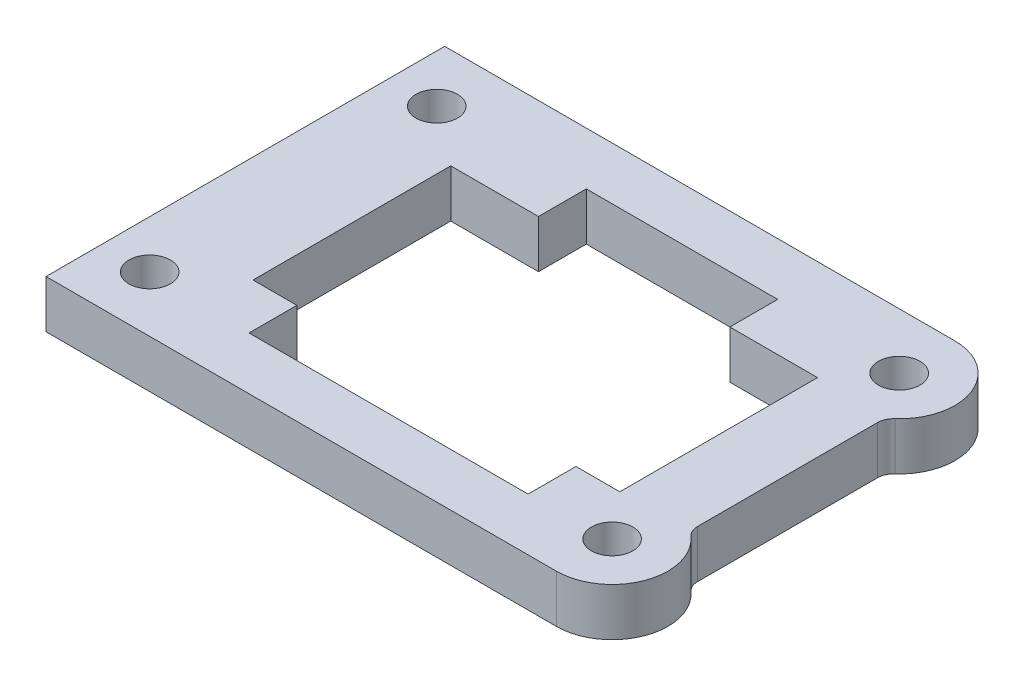
ISO-10303-21;
HEADER;
FILE_DESCRIPTION(('STEP AP214'),'2;1');
FILE_NAME('part.step','',(''),(''),'','','');
FILE_SCHEMA(('AUTOMOTIVE_DESIGN { 1 0 10303 214 1 1 1 1 }'));
ENDSEC;
DATA;
#1=APPLICATION_CONTEXT('core data for automotive mechanical design processes');
#2=APPLICATION_PROTOCOL_DEFINITION('international standard','automotive_design',2000,#1);
#3=PRODUCT_CONTEXT('',#1,'mechanical');
#4=PRODUCT('Part','Part','',(#3));
#5=PRODUCT_RELATED_PRODUCT_CATEGORY('part','',(#4));
#6=PRODUCT_DEFINITION_FORMATION('','',#4);
#7=PRODUCT_DEFINITION_CONTEXT('part definition',#1,'design');
#8=PRODUCT_DEFINITION('design','',#6,#7);
#9=PRODUCT_DEFINITION_SHAPE('','',#8);
#10=(LENGTH_UNIT() NAMED_UNIT(*) SI_UNIT(.MILLI.,.METRE.));
#11=(NAMED_UNIT(*) PLANE_ANGLE_UNIT() SI_UNIT($,.RADIAN.));
#12=(NAMED_UNIT(*) SI_UNIT($,.STERADIAN.) SOLID_ANGLE_UNIT());
#13=UNCERTAINTY_MEASURE_WITH_UNIT(LENGTH_MEASURE(1.E-05),#10,'distance_accuracy_value','');
#14=(GEOMETRIC_REPRESENTATION_CONTEXT(3) GLOBAL_UNCERTAINTY_ASSIGNED_CONTEXT((#13)) GLOBAL_UNIT_ASSIGNED_CONTEXT((#10,
#11,#12)) REPRESENTATION_CONTEXT('',''));
#15=CARTESIAN_POINT('',(0.,0.,0.));
#16=DIRECTION('',(0.,0.,1.));
#17=DIRECTION('',(1.,0.,0.));
#18=AXIS2_PLACEMENT_3D('',#15,#16,#17);
#19=CARTESIAN_POINT('',(-10.82,0.,6.20000000000002));
#20=DIRECTION('',(0.,0.,1.));
#21=DIRECTION('',(1.,0.,0.));
#22=AXIS2_PLACEMENT_3D('',#19,#20,#21);
#23=PLANE('',#22);
#24=DIRECTION('',(1.,0.,0.));
#25=VECTOR('',#24,1.);
#26=CARTESIAN_POINT('',(-10.82,0.,6.20000000000002));
#27=LINE('',#26,#25);
#28=CARTESIAN_POINT('',(9.43,0.,6.20000000000001));
#29=VERTEX_POINT('',#28);
#30=CARTESIAN_POINT('',(12.18,0.,6.2));
#31=VERTEX_POINT('',#30);
#32=EDGE_CURVE('E248',#29,#31,#27,.T.);
#33=ORIENTED_EDGE('',*,*,#32,.F.);
#34=DIRECTION('',(0.,1.,0.));
#35=VECTOR('',#34,1.);
#36=CARTESIAN_POINT('',(9.43,0.,6.20000000000001));
#37=LINE('',#36,#35);
#38=CARTESIAN_POINT('',(9.43,3.,6.20000000000001));
#39=VERTEX_POINT('',#38);
#40=EDGE_CURVE('E225',#29,#39,#37,.T.);
#41=ORIENTED_EDGE('',*,*,#40,.T.);
#42=DIRECTION('',(1.,0.,0.));
#43=VECTOR('',#42,1.);
#44=CARTESIAN_POINT('',(-10.82,3.,6.20000000000002));
#45=LINE('',#44,#43);
#46=CARTESIAN_POINT('',(12.18,3.,6.2));
#47=VERTEX_POINT('',#46);
#48=EDGE_CURVE('E261',#39,#47,#45,.T.);
#49=ORIENTED_EDGE('',*,*,#48,.T.);
#50=DIRECTION('',(0.,1.,0.));
#51=VECTOR('',#50,1.);
#52=CARTESIAN_POINT('',(12.18,0.,6.2));
#53=LINE('',#52,#51);
#54=EDGE_CURVE('E264',#31,#47,#53,.T.);
#55=ORIENTED_EDGE('',*,*,#54,.F.);
#56=EDGE_LOOP('',(#33,#41,#49,#55));
#57=FACE_BOUND('',#56,.T.);
#58=ADVANCED_FACE('F36',(#57),#23,.F.);
#59=CARTESIAN_POINT('',(-10.82,0.,-6.19999999999996));
#60=DIRECTION('',(0.,0.,-1.));
#61=DIRECTION('',(-1.,0.,0.));
#62=AXIS2_PLACEMENT_3D('',#59,#60,#61);
#63=PLANE('',#62);
#64=DIRECTION('',(-1.,0.,0.));
#65=VECTOR('',#64,1.);
#66=CARTESIAN_POINT('',(-10.82,3.,-6.19999999999996));
#67=LINE('',#66,#65);
#68=CARTESIAN_POINT('',(12.18,3.,-6.2));
#69=VERTEX_POINT('',#68);
#70=CARTESIAN_POINT('',(6.68,3.,-6.19999999999997));
#71=VERTEX_POINT('',#70);
#72=EDGE_CURVE('E255',#69,#71,#67,.T.);
#73=ORIENTED_EDGE('',*,*,#72,.T.);
#74=DIRECTION('',(0.,1.,0.));
#75=VECTOR('',#74,1.);
#76=CARTESIAN_POINT('',(6.68,0.,-6.19999999999997));
#77=LINE('',#76,#75);
#78=CARTESIAN_POINT('',(6.68,0.,-6.19999999999997));
#79=VERTEX_POINT('',#78);
#80=EDGE_CURVE('E211',#79,#71,#77,.T.);
#81=ORIENTED_EDGE('',*,*,#80,.F.);
#82=DIRECTION('',(-1.,0.,0.));
#83=VECTOR('',#82,1.);
#84=CARTESIAN_POINT('',(-10.82,0.,-6.19999999999996));
#85=LINE('',#84,#83);
#86=CARTESIAN_POINT('',(12.18,0.,-6.2));
#87=VERTEX_POINT('',#86);
#88=EDGE_CURVE('E199',#87,#79,#85,.T.);
#89=ORIENTED_EDGE('',*,*,#88,.F.);
#90=DIRECTION('',(0.,1.,0.));
#91=VECTOR('',#90,1.);
#92=CARTESIAN_POINT('',(12.18,0.,-6.2));
#93=LINE('',#92,#91);
#94=EDGE_CURVE('E252',#87,#69,#93,.T.);
#95=ORIENTED_EDGE('',*,*,#94,.T.);
#96=EDGE_LOOP('',(#73,#81,#89,#95));
#97=FACE_BOUND('',#96,.T.);
#98=ADVANCED_FACE('F373',(#97),#63,.F.);
#99=CARTESIAN_POINT('',(17.5,3.,-5.64589803375031));
#100=DIRECTION('',(0.,-1.,0.));
#101=DIRECTION('',(0.,0.,-1.));
#102=AXIS2_PLACEMENT_3D('',#99,#100,#101);
#103=CYLINDRICAL_SURFACE('',#102,1.);
#104=CARTESIAN_POINT('',(17.5,0.,-5.64589803375031));
#105=DIRECTION('',(0.,1.,0.));
#106=DIRECTION('',(0.,0.,1.));
#107=AXIS2_PLACEMENT_3D('',#104,#105,#106);
#108=CIRCLE('',#107,1.);
#109=CARTESIAN_POINT('',(16.8333333333333,0.,-6.39125402625024));
#110=VERTEX_POINT('',#109);
#111=CARTESIAN_POINT('',(16.5,0.,-5.64589803375031));
#112=VERTEX_POINT('',#111);
#113=EDGE_CURVE('E267',#110,#112,#108,.T.);
#114=ORIENTED_EDGE('',*,*,#113,.F.);
#115=DIRECTION('',(0.,-1.,0.));
#116=VECTOR('',#115,1.);
#117=CARTESIAN_POINT('',(16.8333333333333,3.,-6.39125402625024));
#118=LINE('',#117,#116);
#119=CARTESIAN_POINT('',(16.8333333333333,3.,-6.39125402625024));
#120=VERTEX_POINT('',#119);
#121=EDGE_CURVE('E11',#120,#110,#118,.T.);
#122=ORIENTED_EDGE('',*,*,#121,.F.);
#123=CARTESIAN_POINT('',(17.5,3.,-5.64589803375031));
#124=DIRECTION('',(0.,1.,0.));
#125=DIRECTION('',(0.,0.,1.));
#126=AXIS2_PLACEMENT_3D('',#123,#124,#125);
#127=CIRCLE('',#126,1.);
#128=CARTESIAN_POINT('',(16.5,3.,-5.64589803375031));
#129=VERTEX_POINT('',#128);
#130=EDGE_CURVE('E275',#120,#129,#127,.T.);
#131=ORIENTED_EDGE('',*,*,#130,.T.);
#132=DIRECTION('',(0.,-1.,0.));
#133=VECTOR('',#132,1.);
#134=CARTESIAN_POINT('',(16.5,3.,-5.64589803375031));
#135=LINE('',#134,#133);
#136=EDGE_CURVE('E40',#129,#112,#135,.T.);
#137=ORIENTED_EDGE('',*,*,#136,.T.);
#138=EDGE_LOOP('',(#114,#122,#131,#137));
#139=FACE_BOUND('',#138,.T.);
#140=ADVANCED_FACE('F38',(#139),#103,.F.);
#141=CARTESIAN_POINT('',(14.5,3.,-9.));
#142=DIRECTION('',(0.,-1.,0.));
#143=DIRECTION('',(0.,0.,-1.));
#144=AXIS2_PLACEMENT_3D('',#141,#142,#143);
#145=CYLINDRICAL_SURFACE('',#144,3.5);
#146=CARTESIAN_POINT('',(14.5,0.,-9.));
#147=DIRECTION('',(0.,-1.,0.));
#148=DIRECTION('',(0.,0.,-1.));
#149=AXIS2_PLACEMENT_3D('',#146,#147,#148);
#150=CIRCLE('',#149,3.5);
#151=CARTESIAN_POINT('',(14.5,0.,-12.5));
#152=VERTEX_POINT('',#151);
#153=EDGE_CURVE('E279',#152,#110,#150,.T.);
#154=ORIENTED_EDGE('',*,*,#153,.F.);
#155=DIRECTION('',(0.,-1.,0.));
#156=VECTOR('',#155,1.);
#157=CARTESIAN_POINT('',(14.5,3.,-12.5));
#158=LINE('',#157,#156);
#159=CARTESIAN_POINT('',(14.5,3.,-12.5));
#160=VERTEX_POINT('',#159);
#161=EDGE_CURVE('E45',#160,#152,#158,.T.);
#162=ORIENTED_EDGE('',*,*,#161,.F.);
#163=CARTESIAN_POINT('',(14.5,3.,-9.));
#164=DIRECTION('',(0.,-1.,0.));
#165=DIRECTION('',(0.,0.,-1.));
#166=AXIS2_PLACEMENT_3D('',#163,#164,#165);
#167=CIRCLE('',#166,3.5);
#168=EDGE_CURVE('E295',#160,#120,#167,.T.);
#169=ORIENTED_EDGE('',*,*,#168,.T.);
#170=ORIENTED_EDGE('',*,*,#121,.T.);
#171=EDGE_LOOP('',(#154,#162,#169,#170));
#172=FACE_BOUND('',#171,.T.);
#173=ADVANCED_FACE('F341',(#172),#145,.T.);
#174=CARTESIAN_POINT('',(-17.5,3.,-12.5));
#175=DIRECTION('',(0.,0.,-1.));
#176=DIRECTION('',(-1.,0.,0.));
#177=AXIS2_PLACEMENT_3D('',#174,#175,#176);
#178=PLANE('',#177);
#179=DIRECTION('',(1.,0.,0.));
#180=VECTOR('',#179,1.);
#181=CARTESIAN_POINT('',(-17.5,0.,-12.5));
#182=LINE('',#181,#180);
#183=CARTESIAN_POINT('',(-17.5,0.,-12.5));
#184=VERTEX_POINT('',#183);
#185=EDGE_CURVE('E314',#184,#152,#182,.T.);
#186=ORIENTED_EDGE('',*,*,#185,.F.);
#187=DIRECTION('',(0.,-1.,0.));
#188=VECTOR('',#187,1.);
#189=CARTESIAN_POINT('',(-17.5,3.,-12.5));
#190=LINE('',#189,#188);
#191=CARTESIAN_POINT('',(-17.5,3.,-12.5));
#192=VERTEX_POINT('',#191);
#193=EDGE_CURVE('E320',#192,#184,#190,.T.);
#194=ORIENTED_EDGE('',*,*,#193,.F.);
#195=DIRECTION('',(1.,0.,0.));
#196=VECTOR('',#195,1.);
#197=CARTESIAN_POINT('',(-17.5,3.,-12.5));
#198=LINE('',#197,#196);
#199=EDGE_CURVE('E292',#192,#160,#198,.T.);
#200=ORIENTED_EDGE('',*,*,#199,.T.);
#201=ORIENTED_EDGE('',*,*,#161,.T.);
#202=EDGE_LOOP('',(#186,#194,#200,#201));
#203=FACE_BOUND('',#202,.T.);
#204=ADVANCED_FACE('F363',(#203),#178,.T.);
#205=CARTESIAN_POINT('',(-17.5,3.,-12.5));
#206=DIRECTION('',(1.,0.,0.));
#207=DIRECTION('',(0.,0.,-1.));
#208=AXIS2_PLACEMENT_3D('',#205,#206,#207);
#209=PLANE('',#208);
#210=DIRECTION('',(0.,0.,1.));
#211=VECTOR('',#210,1.);
#212=CARTESIAN_POINT('',(-17.5,0.,-12.5));
#213=LINE('',#212,#211);
#214=CARTESIAN_POINT('',(-17.5,0.,12.5));
#215=VERTEX_POINT('',#214);
#216=EDGE_CURVE('E312',#184,#215,#213,.T.);
#217=ORIENTED_EDGE('',*,*,#216,.T.);
#218=DIRECTION('',(0.,-1.,0.));
#219=VECTOR('',#218,1.);
#220=CARTESIAN_POINT('',(-17.5,3.,12.5));
#221=LINE('',#220,#219);
#222=CARTESIAN_POINT('',(-17.5,3.,12.5));
#223=VERTEX_POINT('',#222);
#224=EDGE_CURVE('E322',#223,#215,#221,.T.);
#225=ORIENTED_EDGE('',*,*,#224,.F.);
#226=DIRECTION('',(0.,0.,1.));
#227=VECTOR('',#226,1.);
#228=CARTESIAN_POINT('',(-17.5,3.,-12.5));
#229=LINE('',#228,#227);
#230=EDGE_CURVE('E290',#192,#223,#229,.T.);
#231=ORIENTED_EDGE('',*,*,#230,.F.);
#232=ORIENTED_EDGE('',*,*,#193,.T.);
#233=EDGE_LOOP('',(#217,#225,#231,#232));
#234=FACE_BOUND('',#233,.T.);
#235=ADVANCED_FACE('F361',(#234),#209,.F.);
#236=CARTESIAN_POINT('',(-17.5,3.,12.5));
#237=DIRECTION('',(0.,0.,-1.));
#238=DIRECTION('',(-1.,0.,0.));
#239=AXIS2_PLACEMENT_3D('',#236,#237,#238);
#240=PLANE('',#239);
#241=DIRECTION('',(1.,0.,0.));
#242=VECTOR('',#241,1.);
#243=CARTESIAN_POINT('',(-17.5,0.,12.5));
#244=LINE('',#243,#242);
#245=CARTESIAN_POINT('',(14.5,0.,12.5));
#246=VERTEX_POINT('',#245);
#247=EDGE_CURVE('E309',#215,#246,#244,.T.);
#248=ORIENTED_EDGE('',*,*,#247,.T.);
#249=DIRECTION('',(0.,-1.,0.));
#250=VECTOR('',#249,1.);
#251=CARTESIAN_POINT('',(14.5,3.,12.5));
#252=LINE('',#251,#250);
#253=CARTESIAN_POINT('',(14.5,3.,12.5));
#254=VERTEX_POINT('',#253);
#255=EDGE_CURVE('E325',#254,#246,#252,.T.);
#256=ORIENTED_EDGE('',*,*,#255,.F.);
#257=DIRECTION('',(1.,0.,0.));
#258=VECTOR('',#257,1.);
#259=CARTESIAN_POINT('',(-17.5,3.,12.5));
#260=LINE('',#259,#258);
#261=EDGE_CURVE('E288',#223,#254,#260,.T.);
#262=ORIENTED_EDGE('',*,*,#261,.F.);
#263=ORIENTED_EDGE('',*,*,#224,.T.);
#264=EDGE_LOOP('',(#248,#256,#262,#263));
#265=FACE_BOUND('',#264,.T.);
#266=ADVANCED_FACE('F357',(#265),#240,.F.);
#267=CARTESIAN_POINT('',(14.5,3.,9.));
#268=DIRECTION('',(0.,-1.,0.));
#269=DIRECTION('',(0.,0.,-1.));
#270=AXIS2_PLACEMENT_3D('',#267,#268,#269);
#271=CYLINDRICAL_SURFACE('',#270,3.5);
#272=CARTESIAN_POINT('',(14.5,0.,9.));
#273=DIRECTION('',(0.,-1.,0.));
#274=DIRECTION('',(0.,0.,-1.));
#275=AXIS2_PLACEMENT_3D('',#272,#273,#274);
#276=CIRCLE('',#275,3.5);
#277=CARTESIAN_POINT('',(16.8333333333333,0.,6.39125402625023));
#278=VERTEX_POINT('',#277);
#279=EDGE_CURVE('E306',#278,#246,#276,.T.);
#280=ORIENTED_EDGE('',*,*,#279,.F.);
#281=DIRECTION('',(0.,-1.,0.));
#282=VECTOR('',#281,1.);
#283=CARTESIAN_POINT('',(16.8333333333333,3.,6.39125402625023));
#284=LINE('',#283,#282);
#285=CARTESIAN_POINT('',(16.8333333333333,3.,6.39125402625023));
#286=VERTEX_POINT('',#285);
#287=EDGE_CURVE('E327',#286,#278,#284,.T.);
#288=ORIENTED_EDGE('',*,*,#287,.F.);
#289=CARTESIAN_POINT('',(14.5,3.,9.));
#290=DIRECTION('',(0.,-1.,0.));
#291=DIRECTION('',(0.,0.,-1.));
#292=AXIS2_PLACEMENT_3D('',#289,#290,#291);
#293=CIRCLE('',#292,3.5);
#294=EDGE_CURVE('E285',#286,#254,#293,.T.);
#295=ORIENTED_EDGE('',*,*,#294,.T.);
#296=ORIENTED_EDGE('',*,*,#255,.T.);
#297=EDGE_LOOP('',(#280,#288,#295,#296));
#298=FACE_BOUND('',#297,.T.);
#299=ADVANCED_FACE('F353',(#298),#271,.T.);
#300=CARTESIAN_POINT('',(17.5,3.,5.6458980337503));
#301=DIRECTION('',(0.,-1.,0.));
#302=DIRECTION('',(0.,0.,-1.));
#303=AXIS2_PLACEMENT_3D('',#300,#301,#302);
#304=CYLINDRICAL_SURFACE('',#303,0.999999999999999);
#305=CARTESIAN_POINT('',(17.5,0.,5.6458980337503));
#306=DIRECTION('',(0.,1.,0.));
#307=DIRECTION('',(0.,0.,1.));
#308=AXIS2_PLACEMENT_3D('',#305,#306,#307);
#309=CIRCLE('',#308,0.999999999999999);
#310=CARTESIAN_POINT('',(16.5,0.,5.6458980337503));
#311=VERTEX_POINT('',#310);
#312=EDGE_CURVE('E303',#311,#278,#309,.T.);
#313=ORIENTED_EDGE('',*,*,#312,.F.);
#314=DIRECTION('',(0.,-1.,0.));
#315=VECTOR('',#314,1.);
#316=CARTESIAN_POINT('',(16.5,3.,5.6458980337503));
#317=LINE('',#316,#315);
#318=CARTESIAN_POINT('',(16.5,3.,5.6458980337503));
#319=VERTEX_POINT('',#318);
#320=EDGE_CURVE('E328',#319,#311,#317,.T.);
#321=ORIENTED_EDGE('',*,*,#320,.F.);
#322=CARTESIAN_POINT('',(17.5,3.,5.6458980337503));
#323=DIRECTION('',(0.,1.,0.));
#324=DIRECTION('',(0.,0.,1.));
#325=AXIS2_PLACEMENT_3D('',#322,#323,#324);
#326=CIRCLE('',#325,0.999999999999999);
#327=EDGE_CURVE('E282',#319,#286,#326,.T.);
#328=ORIENTED_EDGE('',*,*,#327,.T.);
#329=ORIENTED_EDGE('',*,*,#287,.T.);
#330=EDGE_LOOP('',(#313,#321,#328,#329));
#331=FACE_BOUND('',#330,.T.);
#332=ADVANCED_FACE('F349',(#331),#304,.F.);
#333=CARTESIAN_POINT('',(16.5,3.,-5.64589803375031));
#334=DIRECTION('',(1.,0.,0.));
#335=DIRECTION('',(0.,0.,-1.));
#336=AXIS2_PLACEMENT_3D('',#333,#334,#335);
#337=PLANE('',#336);
#338=DIRECTION('',(0.,0.,1.));
#339=VECTOR('',#338,1.);
#340=CARTESIAN_POINT('',(16.5,0.,-5.64589803375031));
#341=LINE('',#340,#339);
#342=EDGE_CURVE('E300',#112,#311,#341,.T.);
#343=ORIENTED_EDGE('',*,*,#342,.F.);
#344=ORIENTED_EDGE('',*,*,#136,.F.);
#345=DIRECTION('',(0.,0.,1.));
#346=VECTOR('',#345,1.);
#347=CARTESIAN_POINT('',(16.5,3.,-5.64589803375031));
#348=LINE('',#347,#346);
#349=EDGE_CURVE('E278',#129,#319,#348,.T.);
#350=ORIENTED_EDGE('',*,*,#349,.T.);
#351=ORIENTED_EDGE('',*,*,#320,.T.);
#352=EDGE_LOOP('',(#343,#344,#350,#351));
#353=FACE_BOUND('',#352,.T.);
#354=ADVANCED_FACE('F336',(#353),#337,.T.);
#355=CARTESIAN_POINT('',(17.5,3.,-5.64589803375031));
#356=DIRECTION('',(0.,1.,0.));
#357=DIRECTION('',(0.,0.,1.));
#358=AXIS2_PLACEMENT_3D('',#355,#356,#357);
#359=PLANE('',#358);
#360=CARTESIAN_POINT('',(-14.5,3.,-9.));
#361=DIRECTION('',(0.,1.,0.));
#362=DIRECTION('',(0.,0.,1.));
#363=AXIS2_PLACEMENT_3D('',#360,#361,#362);
#364=CIRCLE('',#363,1.3);
#365=CARTESIAN_POINT('',(-14.5,3.,-7.7));
#366=VERTEX_POINT('',#365);
#367=EDGE_CURVE('E459',#366,#366,#364,.T.);
#368=ORIENTED_EDGE('',*,*,#367,.F.);
#369=EDGE_LOOP('',(#368));
#370=FACE_BOUND('',#369,.T.);
#371=CARTESIAN_POINT('',(-14.5,3.,9.));
#372=DIRECTION('',(0.,1.,0.));
#373=DIRECTION('',(0.,0.,1.));
#374=AXIS2_PLACEMENT_3D('',#371,#372,#373);
#375=CIRCLE('',#374,1.3);
#376=CARTESIAN_POINT('',(-14.5,3.,10.3));
#377=VERTEX_POINT('',#376);
#378=EDGE_CURVE('E462',#377,#377,#375,.T.);
#379=ORIENTED_EDGE('',*,*,#378,.F.);
#380=EDGE_LOOP('',(#379));
#381=FACE_BOUND('',#380,.T.);
#382=CARTESIAN_POINT('',(14.5,3.,-9.));
#383=DIRECTION('',(0.,1.,0.));
#384=DIRECTION('',(0.,0.,1.));
#385=AXIS2_PLACEMENT_3D('',#382,#383,#384);
#386=CIRCLE('',#385,1.3);
#387=CARTESIAN_POINT('',(14.5,3.,-7.7));
#388=VERTEX_POINT('',#387);
#389=EDGE_CURVE('E470',#388,#388,#386,.T.);
#390=ORIENTED_EDGE('',*,*,#389,.F.);
#391=EDGE_LOOP('',(#390));
#392=FACE_BOUND('',#391,.T.);
#393=CARTESIAN_POINT('',(14.5,3.,9.));
#394=DIRECTION('',(0.,1.,0.));
#395=DIRECTION('',(0.,0.,1.));
#396=AXIS2_PLACEMENT_3D('',#393,#394,#395);
#397=CIRCLE('',#396,1.3);
#398=CARTESIAN_POINT('',(14.5,3.,10.3));
#399=VERTEX_POINT('',#398);
#400=EDGE_CURVE('E475',#399,#399,#397,.T.);
#401=ORIENTED_EDGE('',*,*,#400,.F.);
#402=EDGE_LOOP('',(#401));
#403=FACE_BOUND('',#402,.T.);
#404=DIRECTION('',(0.,0.,-1.));
#405=VECTOR('',#404,1.);
#406=CARTESIAN_POINT('',(6.68,3.,-9.19999999999997));
#407=LINE('',#406,#405);
#408=CARTESIAN_POINT('',(6.68,3.,-9.19999999999997));
#409=VERTEX_POINT('',#408);
#410=EDGE_CURVE('E180',#71,#409,#407,.T.);
#411=ORIENTED_EDGE('',*,*,#410,.F.);
#412=ORIENTED_EDGE('',*,*,#72,.F.);
#413=DIRECTION('',(0.,0.,-1.));
#414=VECTOR('',#413,1.);
#415=CARTESIAN_POINT('',(12.18,3.,6.2));
#416=LINE('',#415,#414);
#417=EDGE_CURVE('E213',#47,#69,#416,.T.);
#418=ORIENTED_EDGE('',*,*,#417,.F.);
#419=ORIENTED_EDGE('',*,*,#48,.F.);
#420=DIRECTION('',(0.,0.,-1.));
#421=VECTOR('',#420,1.);
#422=CARTESIAN_POINT('',(9.43,3.,9.20000000000001));
#423=LINE('',#422,#421);
#424=CARTESIAN_POINT('',(9.43,3.,9.20000000000001));
#425=VERTEX_POINT('',#424);
#426=EDGE_CURVE('E226',#425,#39,#423,.T.);
#427=ORIENTED_EDGE('',*,*,#426,.F.);
#428=DIRECTION('',(1.,0.,0.));
#429=VECTOR('',#428,1.);
#430=CARTESIAN_POINT('',(-8.07,3.,9.20000000000001));
#431=LINE('',#430,#429);
#432=CARTESIAN_POINT('',(-8.07,3.,9.20000000000001));
#433=VERTEX_POINT('',#432);
#434=EDGE_CURVE('E220',#433,#425,#431,.T.);
#435=ORIENTED_EDGE('',*,*,#434,.F.);
#436=DIRECTION('',(0.,0.,1.));
#437=VECTOR('',#436,1.);
#438=CARTESIAN_POINT('',(-8.07,3.,9.20000000000001));
#439=LINE('',#438,#437);
#440=CARTESIAN_POINT('',(-8.07,3.,6.20000000000002));
#441=VERTEX_POINT('',#440);
#442=EDGE_CURVE('E228',#441,#433,#439,.T.);
#443=ORIENTED_EDGE('',*,*,#442,.F.);
#444=CARTESIAN_POINT('',(-10.82,3.,6.20000000000002));
#445=VERTEX_POINT('',#444);
#446=EDGE_CURVE('E243',#445,#441,#45,.T.);
#447=ORIENTED_EDGE('',*,*,#446,.F.);
#448=DIRECTION('',(0.,0.,1.));
#449=VECTOR('',#448,1.);
#450=CARTESIAN_POINT('',(-10.82,3.,6.20000000000002));
#451=LINE('',#450,#449);
#452=CARTESIAN_POINT('',(-10.82,3.,-6.19999999999996));
#453=VERTEX_POINT('',#452);
#454=EDGE_CURVE('E258',#453,#445,#451,.T.);
#455=ORIENTED_EDGE('',*,*,#454,.F.);
#456=CARTESIAN_POINT('',(-5.32,3.,-6.19999999999997));
#457=VERTEX_POINT('',#456);
#458=EDGE_CURVE('E254',#457,#453,#67,.T.);
#459=ORIENTED_EDGE('',*,*,#458,.F.);
#460=DIRECTION('',(0.,0.,1.));
#461=VECTOR('',#460,1.);
#462=CARTESIAN_POINT('',(-5.32,3.,-9.19999999999997));
#463=LINE('',#462,#461);
#464=CARTESIAN_POINT('',(-5.32,3.,-9.19999999999997));
#465=VERTEX_POINT('',#464);
#466=EDGE_CURVE('E61',#465,#457,#463,.T.);
#467=ORIENTED_EDGE('',*,*,#466,.F.);
#468=DIRECTION('',(-1.,0.,0.));
#469=VECTOR('',#468,1.);
#470=CARTESIAN_POINT('',(-5.32,3.,-9.19999999999997));
#471=LINE('',#470,#469);
#472=EDGE_CURVE('E201',#409,#465,#471,.T.);
#473=ORIENTED_EDGE('',*,*,#472,.F.);
#474=EDGE_LOOP('',(#411,#412,#418,#419,#427,#435,#443,#447,#455,#459,#467,#473));
#475=FACE_BOUND('',#474,.T.);
#476=ORIENTED_EDGE('',*,*,#130,.F.);
#477=ORIENTED_EDGE('',*,*,#168,.F.);
#478=ORIENTED_EDGE('',*,*,#199,.F.);
#479=ORIENTED_EDGE('',*,*,#230,.T.);
#480=ORIENTED_EDGE('',*,*,#261,.T.);
#481=ORIENTED_EDGE('',*,*,#294,.F.);
#482=ORIENTED_EDGE('',*,*,#327,.F.);
#483=ORIENTED_EDGE('',*,*,#349,.F.);
#484=EDGE_LOOP('',(#476,#477,#478,#479,#480,#481,#482,#483));
#485=FACE_BOUND('',#484,.T.);
#486=ADVANCED_FACE('F344',(#370,#381,#392,#403,#475,#485),#359,.T.);
#487=CARTESIAN_POINT('',(17.5,0.,-5.64589803375031));
#488=DIRECTION('',(0.,1.,0.));
#489=DIRECTION('',(0.,0.,1.));
#490=AXIS2_PLACEMENT_3D('',#487,#488,#489);
#491=PLANE('',#490);
#492=CARTESIAN_POINT('',(-14.5,0.,-9.));
#493=DIRECTION('',(0.,1.,0.));
#494=DIRECTION('',(0.,0.,1.));
#495=AXIS2_PLACEMENT_3D('',#492,#493,#494);
#496=CIRCLE('',#495,1.3);
#497=CARTESIAN_POINT('',(-14.5,0.,-7.7));
#498=VERTEX_POINT('',#497);
#499=EDGE_CURVE('E456',#498,#498,#496,.T.);
#500=ORIENTED_EDGE('',*,*,#499,.T.);
#501=EDGE_LOOP('',(#500));
#502=FACE_BOUND('',#501,.T.);
#503=CARTESIAN_POINT('',(-14.5,0.,9.));
#504=DIRECTION('',(0.,1.,0.));
#505=DIRECTION('',(0.,0.,1.));
#506=AXIS2_PLACEMENT_3D('',#503,#504,#505);
#507=CIRCLE('',#506,1.3);
#508=CARTESIAN_POINT('',(-14.5,0.,10.3));
#509=VERTEX_POINT('',#508);
#510=EDGE_CURVE('E467',#509,#509,#507,.T.);
#511=ORIENTED_EDGE('',*,*,#510,.T.);
#512=EDGE_LOOP('',(#511));
#513=FACE_BOUND('',#512,.T.);
#514=CARTESIAN_POINT('',(14.5,0.,-9.));
#515=DIRECTION('',(0.,1.,0.));
#516=DIRECTION('',(0.,0.,1.));
#517=AXIS2_PLACEMENT_3D('',#514,#515,#516);
#518=CIRCLE('',#517,1.3);
#519=CARTESIAN_POINT('',(14.5,0.,-7.7));
#520=VERTEX_POINT('',#519);
#521=EDGE_CURVE('E473',#520,#520,#518,.T.);
#522=ORIENTED_EDGE('',*,*,#521,.T.);
#523=EDGE_LOOP('',(#522));
#524=FACE_BOUND('',#523,.T.);
#525=CARTESIAN_POINT('',(14.5,0.,9.));
#526=DIRECTION('',(0.,1.,0.));
#527=DIRECTION('',(0.,0.,1.));
#528=AXIS2_PLACEMENT_3D('',#525,#526,#527);
#529=CIRCLE('',#528,1.3);
#530=CARTESIAN_POINT('',(14.5,0.,10.3));
#531=VERTEX_POINT('',#530);
#532=EDGE_CURVE('E204',#531,#531,#529,.T.);
#533=ORIENTED_EDGE('',*,*,#532,.T.);
#534=EDGE_LOOP('',(#533));
#535=FACE_BOUND('',#534,.T.);
#536=ORIENTED_EDGE('',*,*,#88,.T.);
#537=DIRECTION('',(0.,0.,-1.));
#538=VECTOR('',#537,1.);
#539=CARTESIAN_POINT('',(6.68,0.,-9.19999999999997));
#540=LINE('',#539,#538);
#541=CARTESIAN_POINT('',(6.68,0.,-9.19999999999997));
#542=VERTEX_POINT('',#541);
#543=EDGE_CURVE('E177',#79,#542,#540,.T.);
#544=ORIENTED_EDGE('',*,*,#543,.T.);
#545=DIRECTION('',(-1.,0.,0.));
#546=VECTOR('',#545,1.);
#547=CARTESIAN_POINT('',(-5.32,0.,-9.19999999999997));
#548=LINE('',#547,#546);
#549=CARTESIAN_POINT('',(-5.32,0.,-9.19999999999997));
#550=VERTEX_POINT('',#549);
#551=EDGE_CURVE('E188',#542,#550,#548,.T.);
#552=ORIENTED_EDGE('',*,*,#551,.T.);
#553=DIRECTION('',(0.,0.,1.));
#554=VECTOR('',#553,1.);
#555=CARTESIAN_POINT('',(-5.32,0.,-9.19999999999997));
#556=LINE('',#555,#554);
#557=CARTESIAN_POINT('',(-5.32,0.,-6.19999999999999));
#558=VERTEX_POINT('',#557);
#559=EDGE_CURVE('E185',#550,#558,#556,.T.);
#560=ORIENTED_EDGE('',*,*,#559,.T.);
#561=CARTESIAN_POINT('',(-10.82,0.,-6.19999999999996));
#562=VERTEX_POINT('',#561);
#563=EDGE_CURVE('E242',#558,#562,#85,.T.);
#564=ORIENTED_EDGE('',*,*,#563,.T.);
#565=DIRECTION('',(0.,0.,1.));
#566=VECTOR('',#565,1.);
#567=CARTESIAN_POINT('',(-10.82,0.,6.20000000000002));
#568=LINE('',#567,#566);
#569=CARTESIAN_POINT('',(-10.82,0.,6.20000000000002));
#570=VERTEX_POINT('',#569);
#571=EDGE_CURVE('E245',#562,#570,#568,.T.);
#572=ORIENTED_EDGE('',*,*,#571,.T.);
#573=CARTESIAN_POINT('',(-8.07,0.,6.20000000000001));
#574=VERTEX_POINT('',#573);
#575=EDGE_CURVE('E249',#570,#574,#27,.T.);
#576=ORIENTED_EDGE('',*,*,#575,.T.);
#577=DIRECTION('',(0.,0.,1.));
#578=VECTOR('',#577,1.);
#579=CARTESIAN_POINT('',(-8.07,0.,9.20000000000001));
#580=LINE('',#579,#578);
#581=CARTESIAN_POINT('',(-8.07,0.,9.20000000000001));
#582=VERTEX_POINT('',#581);
#583=EDGE_CURVE('E53',#574,#582,#580,.T.);
#584=ORIENTED_EDGE('',*,*,#583,.T.);
#585=DIRECTION('',(1.,0.,0.));
#586=VECTOR('',#585,1.);
#587=CARTESIAN_POINT('',(-8.07,0.,9.20000000000001));
#588=LINE('',#587,#586);
#589=CARTESIAN_POINT('',(9.43,0.,9.20000000000001));
#590=VERTEX_POINT('',#589);
#591=EDGE_CURVE('E222',#582,#590,#588,.T.);
#592=ORIENTED_EDGE('',*,*,#591,.T.);
#593=DIRECTION('',(0.,0.,-1.));
#594=VECTOR('',#593,1.);
#595=CARTESIAN_POINT('',(9.43,0.,9.20000000000001));
#596=LINE('',#595,#594);
#597=EDGE_CURVE('E217',#590,#29,#596,.T.);
#598=ORIENTED_EDGE('',*,*,#597,.T.);
#599=ORIENTED_EDGE('',*,*,#32,.T.);
#600=DIRECTION('',(0.,0.,-1.));
#601=VECTOR('',#600,1.);
#602=CARTESIAN_POINT('',(12.18,0.,6.2));
#603=LINE('',#602,#601);
#604=EDGE_CURVE('E240',#31,#87,#603,.T.);
#605=ORIENTED_EDGE('',*,*,#604,.T.);
#606=EDGE_LOOP('',(#536,#544,#552,#560,#564,#572,#576,#584,#592,#598,#599,#605));
#607=FACE_BOUND('',#606,.T.);
#608=ORIENTED_EDGE('',*,*,#113,.T.);
#609=ORIENTED_EDGE('',*,*,#342,.T.);
#610=ORIENTED_EDGE('',*,*,#312,.T.);
#611=ORIENTED_EDGE('',*,*,#279,.T.);
#612=ORIENTED_EDGE('',*,*,#247,.F.);
#613=ORIENTED_EDGE('',*,*,#216,.F.);
#614=ORIENTED_EDGE('',*,*,#185,.T.);
#615=ORIENTED_EDGE('',*,*,#153,.T.);
#616=EDGE_LOOP('',(#608,#609,#610,#611,#612,#613,#614,#615));
#617=FACE_BOUND('',#616,.T.);
#618=ADVANCED_FACE('F195',(#502,#513,#524,#535,#607,#617),#491,.F.);
#619=CARTESIAN_POINT('',(12.18,0.,6.2));
#620=DIRECTION('',(1.,0.,0.));
#621=DIRECTION('',(0.,0.,-1.));
#622=AXIS2_PLACEMENT_3D('',#619,#620,#621);
#623=PLANE('',#622);
#624=ORIENTED_EDGE('',*,*,#417,.T.);
#625=ORIENTED_EDGE('',*,*,#94,.F.);
#626=ORIENTED_EDGE('',*,*,#604,.F.);
#627=ORIENTED_EDGE('',*,*,#54,.T.);
#628=EDGE_LOOP('',(#624,#625,#626,#627));
#629=FACE_BOUND('',#628,.T.);
#630=ADVANCED_FACE('F388',(#629),#623,.F.);
#631=ORIENTED_EDGE('',*,*,#446,.T.);
#632=DIRECTION('',(0.,1.,0.));
#633=VECTOR('',#632,1.);
#634=CARTESIAN_POINT('',(-8.07,0.,6.20000000000002));
#635=LINE('',#634,#633);
#636=EDGE_CURVE('E236',#574,#441,#635,.T.);
#637=ORIENTED_EDGE('',*,*,#636,.F.);
#638=ORIENTED_EDGE('',*,*,#575,.F.);
#639=DIRECTION('',(0.,1.,0.));
#640=VECTOR('',#639,1.);
#641=CARTESIAN_POINT('',(-10.82,0.,6.20000000000002));
#642=LINE('',#641,#640);
#643=EDGE_CURVE('E268',#570,#445,#642,.T.);
#644=ORIENTED_EDGE('',*,*,#643,.T.);
#645=EDGE_LOOP('',(#631,#637,#638,#644));
#646=FACE_BOUND('',#645,.T.);
#647=ADVANCED_FACE('F376',(#646),#23,.F.);
#648=CARTESIAN_POINT('',(-10.82,0.,6.20000000000002));
#649=DIRECTION('',(-1.,0.,0.));
#650=DIRECTION('',(0.,0.,1.));
#651=AXIS2_PLACEMENT_3D('',#648,#649,#650);
#652=PLANE('',#651);
#653=ORIENTED_EDGE('',*,*,#454,.T.);
#654=ORIENTED_EDGE('',*,*,#643,.F.);
#655=ORIENTED_EDGE('',*,*,#571,.F.);
#656=DIRECTION('',(0.,1.,0.));
#657=VECTOR('',#656,1.);
#658=CARTESIAN_POINT('',(-10.82,0.,-6.19999999999996));
#659=LINE('',#658,#657);
#660=EDGE_CURVE('E270',#562,#453,#659,.T.);
#661=ORIENTED_EDGE('',*,*,#660,.T.);
#662=EDGE_LOOP('',(#653,#654,#655,#661));
#663=FACE_BOUND('',#662,.T.);
#664=ADVANCED_FACE('F387',(#663),#652,.F.);
#665=ORIENTED_EDGE('',*,*,#563,.F.);
#666=DIRECTION('',(0.,1.,0.));
#667=VECTOR('',#666,1.);
#668=CARTESIAN_POINT('',(-5.32,0.,-6.19999999999999));
#669=LINE('',#668,#667);
#670=EDGE_CURVE('E214',#558,#457,#669,.T.);
#671=ORIENTED_EDGE('',*,*,#670,.T.);
#672=ORIENTED_EDGE('',*,*,#458,.T.);
#673=ORIENTED_EDGE('',*,*,#660,.F.);
#674=EDGE_LOOP('',(#665,#671,#672,#673));
#675=FACE_BOUND('',#674,.T.);
#676=ADVANCED_FACE('F382',(#675),#63,.F.);
#677=CARTESIAN_POINT('',(6.68,0.,-9.19999999999997));
#678=DIRECTION('',(1.,0.,0.));
#679=DIRECTION('',(0.,0.,-1.));
#680=AXIS2_PLACEMENT_3D('',#677,#678,#679);
#681=PLANE('',#680);
#682=ORIENTED_EDGE('',*,*,#410,.T.);
#683=DIRECTION('',(0.,1.,0.));
#684=VECTOR('',#683,1.);
#685=CARTESIAN_POINT('',(6.68,0.,-9.19999999999997));
#686=LINE('',#685,#684);
#687=EDGE_CURVE('E173',#542,#409,#686,.T.);
#688=ORIENTED_EDGE('',*,*,#687,.F.);
#689=ORIENTED_EDGE('',*,*,#543,.F.);
#690=ORIENTED_EDGE('',*,*,#80,.T.);
#691=EDGE_LOOP('',(#682,#688,#689,#690));
#692=FACE_BOUND('',#691,.T.);
#693=ADVANCED_FACE('F175',(#692),#681,.F.);
#694=CARTESIAN_POINT('',(-5.32,0.,-9.19999999999997));
#695=DIRECTION('',(-1.,0.,0.));
#696=DIRECTION('',(0.,0.,1.));
#697=AXIS2_PLACEMENT_3D('',#694,#695,#696);
#698=PLANE('',#697);
#699=ORIENTED_EDGE('',*,*,#466,.T.);
#700=ORIENTED_EDGE('',*,*,#670,.F.);
#701=ORIENTED_EDGE('',*,*,#559,.F.);
#702=DIRECTION('',(0.,1.,0.));
#703=VECTOR('',#702,1.);
#704=CARTESIAN_POINT('',(-5.32,0.,-9.19999999999997));
#705=LINE('',#704,#703);
#706=EDGE_CURVE('E184',#550,#465,#705,.T.);
#707=ORIENTED_EDGE('',*,*,#706,.T.);
#708=EDGE_LOOP('',(#699,#700,#701,#707));
#709=FACE_BOUND('',#708,.T.);
#710=ADVANCED_FACE('F427',(#709),#698,.F.);
#711=CARTESIAN_POINT('',(-5.32,0.,-9.19999999999997));
#712=DIRECTION('',(0.,0.,-1.));
#713=DIRECTION('',(-1.,0.,0.));
#714=AXIS2_PLACEMENT_3D('',#711,#712,#713);
#715=PLANE('',#714);
#716=ORIENTED_EDGE('',*,*,#472,.T.);
#717=ORIENTED_EDGE('',*,*,#706,.F.);
#718=ORIENTED_EDGE('',*,*,#551,.F.);
#719=ORIENTED_EDGE('',*,*,#687,.T.);
#720=EDGE_LOOP('',(#716,#717,#718,#719));
#721=FACE_BOUND('',#720,.T.);
#722=ADVANCED_FACE('F189',(#721),#715,.F.);
#723=CARTESIAN_POINT('',(9.43,0.,9.20000000000001));
#724=DIRECTION('',(1.,0.,0.));
#725=DIRECTION('',(0.,0.,-1.));
#726=AXIS2_PLACEMENT_3D('',#723,#724,#725);
#727=PLANE('',#726);
#728=ORIENTED_EDGE('',*,*,#426,.T.);
#729=ORIENTED_EDGE('',*,*,#40,.F.);
#730=ORIENTED_EDGE('',*,*,#597,.F.);
#731=DIRECTION('',(0.,1.,0.));
#732=VECTOR('',#731,1.);
#733=CARTESIAN_POINT('',(9.43,0.,9.20000000000001));
#734=LINE('',#733,#732);
#735=EDGE_CURVE('E209',#590,#425,#734,.T.);
#736=ORIENTED_EDGE('',*,*,#735,.T.);
#737=EDGE_LOOP('',(#728,#729,#730,#736));
#738=FACE_BOUND('',#737,.T.);
#739=ADVANCED_FACE('F420',(#738),#727,.F.);
#740=CARTESIAN_POINT('',(-8.07,0.,9.20000000000001));
#741=DIRECTION('',(0.,0.,1.));
#742=DIRECTION('',(1.,0.,0.));
#743=AXIS2_PLACEMENT_3D('',#740,#741,#742);
#744=PLANE('',#743);
#745=ORIENTED_EDGE('',*,*,#434,.T.);
#746=ORIENTED_EDGE('',*,*,#735,.F.);
#747=ORIENTED_EDGE('',*,*,#591,.F.);
#748=DIRECTION('',(0.,1.,0.));
#749=VECTOR('',#748,1.);
#750=CARTESIAN_POINT('',(-8.07,0.,9.20000000000001));
#751=LINE('',#750,#749);
#752=EDGE_CURVE('E234',#582,#433,#751,.T.);
#753=ORIENTED_EDGE('',*,*,#752,.T.);
#754=EDGE_LOOP('',(#745,#746,#747,#753));
#755=FACE_BOUND('',#754,.T.);
#756=ADVANCED_FACE('F408',(#755),#744,.F.);
#757=CARTESIAN_POINT('',(-8.07,0.,9.20000000000001));
#758=DIRECTION('',(-1.,0.,0.));
#759=DIRECTION('',(0.,0.,1.));
#760=AXIS2_PLACEMENT_3D('',#757,#758,#759);
#761=PLANE('',#760);
#762=ORIENTED_EDGE('',*,*,#442,.T.);
#763=ORIENTED_EDGE('',*,*,#752,.F.);
#764=ORIENTED_EDGE('',*,*,#583,.F.);
#765=ORIENTED_EDGE('',*,*,#636,.T.);
#766=EDGE_LOOP('',(#762,#763,#764,#765));
#767=FACE_BOUND('',#766,.T.);
#768=ADVANCED_FACE('F405',(#767),#761,.F.);
#769=CARTESIAN_POINT('',(14.5,3.,9.));
#770=DIRECTION('',(0.,1.,0.));
#771=DIRECTION('',(0.,0.,1.));
#772=AXIS2_PLACEMENT_3D('',#769,#770,#771);
#773=CYLINDRICAL_SURFACE('',#772,1.3);
#774=ORIENTED_EDGE('',*,*,#532,.F.);
#775=EDGE_LOOP('',(#774));
#776=FACE_BOUND('',#775,.T.);
#777=ORIENTED_EDGE('',*,*,#400,.T.);
#778=EDGE_LOOP('',(#777));
#779=FACE_BOUND('',#778,.T.);
#780=ADVANCED_FACE('F431',(#776,#779),#773,.F.);
#781=CARTESIAN_POINT('',(14.5,3.,-9.));
#782=DIRECTION('',(0.,1.,0.));
#783=DIRECTION('',(0.,0.,1.));
#784=AXIS2_PLACEMENT_3D('',#781,#782,#783);
#785=CYLINDRICAL_SURFACE('',#784,1.3);
#786=ORIENTED_EDGE('',*,*,#521,.F.);
#787=EDGE_LOOP('',(#786));
#788=FACE_BOUND('',#787,.T.);
#789=ORIENTED_EDGE('',*,*,#389,.T.);
#790=EDGE_LOOP('',(#789));
#791=FACE_BOUND('',#790,.T.);
#792=ADVANCED_FACE('F439',(#788,#791),#785,.F.);
#793=CARTESIAN_POINT('',(-14.5,3.,9.));
#794=DIRECTION('',(0.,1.,0.));
#795=DIRECTION('',(0.,0.,1.));
#796=AXIS2_PLACEMENT_3D('',#793,#794,#795);
#797=CYLINDRICAL_SURFACE('',#796,1.3);
#798=ORIENTED_EDGE('',*,*,#510,.F.);
#799=EDGE_LOOP('',(#798));
#800=FACE_BOUND('',#799,.T.);
#801=ORIENTED_EDGE('',*,*,#378,.T.);
#802=EDGE_LOOP('',(#801));
#803=FACE_BOUND('',#802,.T.);
#804=ADVANCED_FACE('F443',(#800,#803),#797,.F.);
#805=CARTESIAN_POINT('',(-14.5,3.,-9.));
#806=DIRECTION('',(0.,1.,0.));
#807=DIRECTION('',(0.,0.,1.));
#808=AXIS2_PLACEMENT_3D('',#805,#806,#807);
#809=CYLINDRICAL_SURFACE('',#808,1.3);
#810=ORIENTED_EDGE('',*,*,#499,.F.);
#811=EDGE_LOOP('',(#810));
#812=FACE_BOUND('',#811,.T.);
#813=ORIENTED_EDGE('',*,*,#367,.T.);
#814=EDGE_LOOP('',(#813));
#815=FACE_BOUND('',#814,.T.);
#816=ADVANCED_FACE('F447',(#812,#815),#809,.F.);
#817=CLOSED_SHELL('',(#58,#98,#140,#173,#204,#235,#266,#299,#332,#354,#486,#618,#630,#647,#664,
#676,#693,#710,#722,#739,#756,#768,#780,#792,#804,#816));
#818=MANIFOLD_SOLID_BREP('B2',#817);
#819=ADVANCED_BREP_SHAPE_REPRESENTATION('',(#18,#818),#14);
#820=SHAPE_DEFINITION_REPRESENTATION(#9,#819);
ENDSEC;
END-ISO-10303-21;
